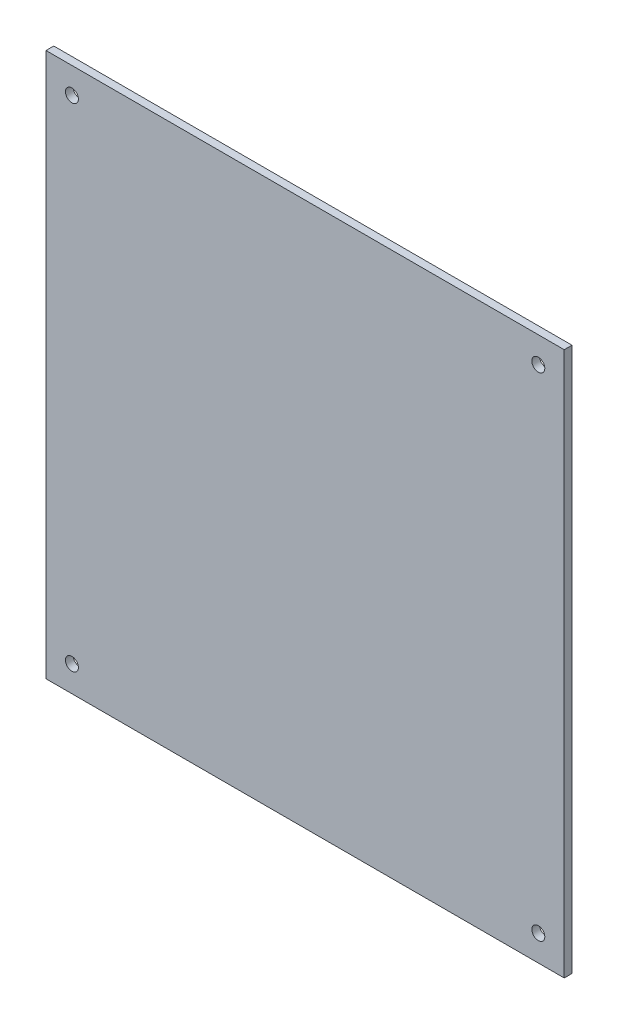
ISO-10303-21;
HEADER;
FILE_DESCRIPTION(('STEP AP214'),'2;1');
FILE_NAME('part.step','',(''),(''),'','','');
FILE_SCHEMA(('AUTOMOTIVE_DESIGN { 1 0 10303 214 1 1 1 1 }'));
ENDSEC;
DATA;
#1=APPLICATION_CONTEXT('core data for automotive mechanical design processes');
#2=APPLICATION_PROTOCOL_DEFINITION('international standard','automotive_design',2000,#1);
#3=PRODUCT_CONTEXT('',#1,'mechanical');
#4=PRODUCT('Part','Part','',(#3));
#5=PRODUCT_RELATED_PRODUCT_CATEGORY('part','',(#4));
#6=PRODUCT_DEFINITION_FORMATION('','',#4);
#7=PRODUCT_DEFINITION_CONTEXT('part definition',#1,'design');
#8=PRODUCT_DEFINITION('design','',#6,#7);
#9=PRODUCT_DEFINITION_SHAPE('','',#8);
#10=(LENGTH_UNIT() NAMED_UNIT(*) SI_UNIT(.MILLI.,.METRE.));
#11=(NAMED_UNIT(*) PLANE_ANGLE_UNIT() SI_UNIT($,.RADIAN.));
#12=(NAMED_UNIT(*) SI_UNIT($,.STERADIAN.) SOLID_ANGLE_UNIT());
#13=UNCERTAINTY_MEASURE_WITH_UNIT(LENGTH_MEASURE(1.E-05),#10,'distance_accuracy_value','');
#14=(GEOMETRIC_REPRESENTATION_CONTEXT(3) GLOBAL_UNCERTAINTY_ASSIGNED_CONTEXT((#13)) GLOBAL_UNIT_ASSIGNED_CONTEXT((#10,
#11,#12)) REPRESENTATION_CONTEXT('',''));
#15=CARTESIAN_POINT('',(0.,0.,0.));
#16=DIRECTION('',(0.,0.,1.));
#17=DIRECTION('',(1.,0.,0.));
#18=AXIS2_PLACEMENT_3D('',#15,#16,#17);
#19=CARTESIAN_POINT('',(0.,0.,13.0000000000026));
#20=DIRECTION('',(0.,0.,1.));
#21=DIRECTION('',(1.,0.,0.));
#22=AXIS2_PLACEMENT_3D('',#19,#20,#21);
#23=PLANE('',#22);
#24=CARTESIAN_POINT('',(180.,20.,13.0000000000026));
#25=DIRECTION('',(0.,0.,1.));
#26=DIRECTION('',(1.,0.,0.));
#27=AXIS2_PLACEMENT_3D('',#24,#25,#26);
#28=CIRCLE('',#27,2.5);
#29=CARTESIAN_POINT('',(182.5,20.,13.0000000000026));
#30=VERTEX_POINT('',#29);
#31=EDGE_CURVE('E129',#30,#30,#28,.T.);
#32=ORIENTED_EDGE('',*,*,#31,.F.);
#33=EDGE_LOOP('',(#32));
#34=FACE_BOUND('',#33,.T.);
#35=CARTESIAN_POINT('',(1.17638189785784E-13,210.,13.0000000000026));
#36=DIRECTION('',(0.,0.,1.));
#37=DIRECTION('',(1.,0.,0.));
#38=AXIS2_PLACEMENT_3D('',#35,#36,#37);
#39=CIRCLE('',#38,2.5);
#40=CARTESIAN_POINT('',(2.50000000000012,210.,13.0000000000026));
#41=VERTEX_POINT('',#40);
#42=EDGE_CURVE('E108',#41,#41,#39,.T.);
#43=ORIENTED_EDGE('',*,*,#42,.F.);
#44=EDGE_LOOP('',(#43));
#45=FACE_BOUND('',#44,.T.);
#46=DIRECTION('',(0.,-1.,0.));
#47=VECTOR('',#46,1.);
#48=CARTESIAN_POINT('',(-10.,220.,13.0000000000026));
#49=LINE('',#48,#47);
#50=CARTESIAN_POINT('',(-10.,220.,13.0000000000026));
#51=VERTEX_POINT('',#50);
#52=CARTESIAN_POINT('',(-10.,9.99999999999998,13.0000000000026));
#53=VERTEX_POINT('',#52);
#54=EDGE_CURVE('E93',#51,#53,#49,.T.);
#55=ORIENTED_EDGE('',*,*,#54,.T.);
#56=DIRECTION('',(1.,0.,0.));
#57=VECTOR('',#56,1.);
#58=CARTESIAN_POINT('',(-10.,9.99999999999998,13.0000000000026));
#59=LINE('',#58,#57);
#60=CARTESIAN_POINT('',(190.,9.99999999999998,13.0000000000026));
#61=VERTEX_POINT('',#60);
#62=EDGE_CURVE('E88',#53,#61,#59,.T.);
#63=ORIENTED_EDGE('',*,*,#62,.T.);
#64=DIRECTION('',(0.,1.,0.));
#65=VECTOR('',#64,1.);
#66=CARTESIAN_POINT('',(190.,220.,13.0000000000026));
#67=LINE('',#66,#65);
#68=CARTESIAN_POINT('',(190.,220.,13.0000000000026));
#69=VERTEX_POINT('',#68);
#70=EDGE_CURVE('E91',#61,#69,#67,.T.);
#71=ORIENTED_EDGE('',*,*,#70,.T.);
#72=DIRECTION('',(-1.,0.,0.));
#73=VECTOR('',#72,1.);
#74=CARTESIAN_POINT('',(-10.,220.,13.0000000000026));
#75=LINE('',#74,#73);
#76=EDGE_CURVE('E58',#69,#51,#75,.T.);
#77=ORIENTED_EDGE('',*,*,#76,.T.);
#78=EDGE_LOOP('',(#55,#63,#71,#77));
#79=FACE_BOUND('',#78,.T.);
#80=CARTESIAN_POINT('',(180.,210.,13.0000000000026));
#81=DIRECTION('',(0.,0.,1.));
#82=DIRECTION('',(-1.,0.,0.));
#83=AXIS2_PLACEMENT_3D('',#80,#81,#82);
#84=CIRCLE('',#83,2.5);
#85=CARTESIAN_POINT('',(177.5,210.,13.0000000000026));
#86=VERTEX_POINT('',#85);
#87=EDGE_CURVE('E123',#86,#86,#84,.T.);
#88=ORIENTED_EDGE('',*,*,#87,.F.);
#89=EDGE_LOOP('',(#88));
#90=FACE_BOUND('',#89,.T.);
#91=CARTESIAN_POINT('',(1.10699295881877E-13,20.,13.0000000000026));
#92=DIRECTION('',(0.,0.,1.));
#93=DIRECTION('',(-1.,0.,0.));
#94=AXIS2_PLACEMENT_3D('',#91,#92,#93);
#95=CIRCLE('',#94,2.5);
#96=CARTESIAN_POINT('',(-2.49999999999989,20.,13.0000000000026));
#97=VERTEX_POINT('',#96);
#98=EDGE_CURVE('E135',#97,#97,#95,.T.);
#99=ORIENTED_EDGE('',*,*,#98,.F.);
#100=EDGE_LOOP('',(#99));
#101=FACE_BOUND('',#100,.T.);
#102=ADVANCED_FACE('F41',(#34,#45,#79,#90,#101),#23,.T.);
#103=CARTESIAN_POINT('',(0.,0.,10.0000000000026));
#104=DIRECTION('',(0.,0.,1.));
#105=DIRECTION('',(1.,0.,0.));
#106=AXIS2_PLACEMENT_3D('',#103,#104,#105);
#107=PLANE('',#106);
#108=DIRECTION('',(0.,-1.,0.));
#109=VECTOR('',#108,1.);
#110=CARTESIAN_POINT('',(-10.,220.,10.0000000000026));
#111=LINE('',#110,#109);
#112=CARTESIAN_POINT('',(-10.,220.,10.0000000000026));
#113=VERTEX_POINT('',#112);
#114=CARTESIAN_POINT('',(-10.,9.99999999999998,10.0000000000026));
#115=VERTEX_POINT('',#114);
#116=EDGE_CURVE('E105',#113,#115,#111,.T.);
#117=ORIENTED_EDGE('',*,*,#116,.F.);
#118=DIRECTION('',(-1.,0.,0.));
#119=VECTOR('',#118,1.);
#120=CARTESIAN_POINT('',(-10.,220.,10.0000000000026));
#121=LINE('',#120,#119);
#122=CARTESIAN_POINT('',(190.,220.,10.0000000000026));
#123=VERTEX_POINT('',#122);
#124=EDGE_CURVE('E81',#123,#113,#121,.T.);
#125=ORIENTED_EDGE('',*,*,#124,.F.);
#126=DIRECTION('',(0.,1.,0.));
#127=VECTOR('',#126,1.);
#128=CARTESIAN_POINT('',(190.,220.,10.0000000000026));
#129=LINE('',#128,#127);
#130=CARTESIAN_POINT('',(190.,9.99999999999998,10.0000000000026));
#131=VERTEX_POINT('',#130);
#132=EDGE_CURVE('E75',#131,#123,#129,.T.);
#133=ORIENTED_EDGE('',*,*,#132,.F.);
#134=DIRECTION('',(1.,0.,0.));
#135=VECTOR('',#134,1.);
#136=CARTESIAN_POINT('',(-10.,9.99999999999998,10.0000000000026));
#137=LINE('',#136,#135);
#138=EDGE_CURVE('E97',#115,#131,#137,.T.);
#139=ORIENTED_EDGE('',*,*,#138,.F.);
#140=EDGE_LOOP('',(#117,#125,#133,#139));
#141=FACE_BOUND('',#140,.T.);
#142=CARTESIAN_POINT('',(1.17638189785784E-13,210.,10.0000000000026));
#143=DIRECTION('',(0.,0.,1.));
#144=DIRECTION('',(1.,0.,0.));
#145=AXIS2_PLACEMENT_3D('',#142,#143,#144);
#146=CIRCLE('',#145,2.5);
#147=CARTESIAN_POINT('',(2.50000000000012,210.,10.0000000000026));
#148=VERTEX_POINT('',#147);
#149=EDGE_CURVE('E120',#148,#148,#146,.T.);
#150=ORIENTED_EDGE('',*,*,#149,.T.);
#151=EDGE_LOOP('',(#150));
#152=FACE_BOUND('',#151,.T.);
#153=CARTESIAN_POINT('',(180.,210.,10.0000000000026));
#154=DIRECTION('',(0.,0.,1.));
#155=DIRECTION('',(-1.,0.,0.));
#156=AXIS2_PLACEMENT_3D('',#153,#154,#155);
#157=CIRCLE('',#156,2.5);
#158=CARTESIAN_POINT('',(177.5,210.,10.0000000000026));
#159=VERTEX_POINT('',#158);
#160=EDGE_CURVE('E126',#159,#159,#157,.T.);
#161=ORIENTED_EDGE('',*,*,#160,.T.);
#162=EDGE_LOOP('',(#161));
#163=FACE_BOUND('',#162,.T.);
#164=CARTESIAN_POINT('',(180.,20.,10.0000000000026));
#165=DIRECTION('',(0.,0.,1.));
#166=DIRECTION('',(1.,0.,0.));
#167=AXIS2_PLACEMENT_3D('',#164,#165,#166);
#168=CIRCLE('',#167,2.5);
#169=CARTESIAN_POINT('',(182.5,20.,10.0000000000026));
#170=VERTEX_POINT('',#169);
#171=EDGE_CURVE('E132',#170,#170,#168,.T.);
#172=ORIENTED_EDGE('',*,*,#171,.T.);
#173=EDGE_LOOP('',(#172));
#174=FACE_BOUND('',#173,.T.);
#175=CARTESIAN_POINT('',(1.10699295881877E-13,20.,10.0000000000026));
#176=DIRECTION('',(0.,0.,1.));
#177=DIRECTION('',(-1.,0.,0.));
#178=AXIS2_PLACEMENT_3D('',#175,#176,#177);
#179=CIRCLE('',#178,2.5);
#180=CARTESIAN_POINT('',(-2.49999999999989,20.,10.0000000000026));
#181=VERTEX_POINT('',#180);
#182=EDGE_CURVE('E138',#181,#181,#179,.T.);
#183=ORIENTED_EDGE('',*,*,#182,.T.);
#184=EDGE_LOOP('',(#183));
#185=FACE_BOUND('',#184,.T.);
#186=ADVANCED_FACE('F116',(#141,#152,#163,#174,#185),#107,.F.);
#187=CARTESIAN_POINT('',(-10.,220.,13.0000000000026));
#188=DIRECTION('',(1.,0.,0.));
#189=DIRECTION('',(0.,0.,-1.));
#190=AXIS2_PLACEMENT_3D('',#187,#188,#189);
#191=PLANE('',#190);
#192=ORIENTED_EDGE('',*,*,#116,.T.);
#193=DIRECTION('',(0.,0.,-1.));
#194=VECTOR('',#193,1.);
#195=CARTESIAN_POINT('',(-10.,9.99999999999998,13.0000000000026));
#196=LINE('',#195,#194);
#197=EDGE_CURVE('E11',#53,#115,#196,.T.);
#198=ORIENTED_EDGE('',*,*,#197,.F.);
#199=ORIENTED_EDGE('',*,*,#54,.F.);
#200=DIRECTION('',(0.,0.,-1.));
#201=VECTOR('',#200,1.);
#202=CARTESIAN_POINT('',(-10.,220.,13.0000000000026));
#203=LINE('',#202,#201);
#204=EDGE_CURVE('E101',#51,#113,#203,.T.);
#205=ORIENTED_EDGE('',*,*,#204,.T.);
#206=EDGE_LOOP('',(#192,#198,#199,#205));
#207=FACE_BOUND('',#206,.T.);
#208=ADVANCED_FACE('F43',(#207),#191,.F.);
#209=CARTESIAN_POINT('',(-10.,9.99999999999998,13.0000000000026));
#210=DIRECTION('',(0.,1.,0.));
#211=DIRECTION('',(0.,0.,1.));
#212=AXIS2_PLACEMENT_3D('',#209,#210,#211);
#213=PLANE('',#212);
#214=ORIENTED_EDGE('',*,*,#138,.T.);
#215=DIRECTION('',(0.,0.,-1.));
#216=VECTOR('',#215,1.);
#217=CARTESIAN_POINT('',(190.,9.99999999999998,13.0000000000026));
#218=LINE('',#217,#216);
#219=EDGE_CURVE('E50',#61,#131,#218,.T.);
#220=ORIENTED_EDGE('',*,*,#219,.F.);
#221=ORIENTED_EDGE('',*,*,#62,.F.);
#222=ORIENTED_EDGE('',*,*,#197,.T.);
#223=EDGE_LOOP('',(#214,#220,#221,#222));
#224=FACE_BOUND('',#223,.T.);
#225=ADVANCED_FACE('F96',(#224),#213,.F.);
#226=CARTESIAN_POINT('',(190.,220.,13.0000000000026));
#227=DIRECTION('',(-1.,0.,0.));
#228=DIRECTION('',(0.,0.,1.));
#229=AXIS2_PLACEMENT_3D('',#226,#227,#228);
#230=PLANE('',#229);
#231=ORIENTED_EDGE('',*,*,#132,.T.);
#232=DIRECTION('',(0.,0.,-1.));
#233=VECTOR('',#232,1.);
#234=CARTESIAN_POINT('',(190.,220.,13.0000000000026));
#235=LINE('',#234,#233);
#236=EDGE_CURVE('E98',#69,#123,#235,.T.);
#237=ORIENTED_EDGE('',*,*,#236,.F.);
#238=ORIENTED_EDGE('',*,*,#70,.F.);
#239=ORIENTED_EDGE('',*,*,#219,.T.);
#240=EDGE_LOOP('',(#231,#237,#238,#239));
#241=FACE_BOUND('',#240,.T.);
#242=ADVANCED_FACE('F99',(#241),#230,.F.);
#243=CARTESIAN_POINT('',(-10.,220.,13.0000000000026));
#244=DIRECTION('',(0.,-1.,0.));
#245=DIRECTION('',(0.,0.,-1.));
#246=AXIS2_PLACEMENT_3D('',#243,#244,#245);
#247=PLANE('',#246);
#248=ORIENTED_EDGE('',*,*,#124,.T.);
#249=ORIENTED_EDGE('',*,*,#204,.F.);
#250=ORIENTED_EDGE('',*,*,#76,.F.);
#251=ORIENTED_EDGE('',*,*,#236,.T.);
#252=EDGE_LOOP('',(#248,#249,#250,#251));
#253=FACE_BOUND('',#252,.T.);
#254=ADVANCED_FACE('F113',(#253),#247,.F.);
#255=CARTESIAN_POINT('',(1.17638189785784E-13,210.,13.0000000000026));
#256=DIRECTION('',(0.,0.,-1.));
#257=DIRECTION('',(-1.,0.,0.));
#258=AXIS2_PLACEMENT_3D('',#255,#256,#257);
#259=CYLINDRICAL_SURFACE('',#258,2.5);
#260=ORIENTED_EDGE('',*,*,#42,.T.);
#261=EDGE_LOOP('',(#260));
#262=FACE_BOUND('',#261,.T.);
#263=ORIENTED_EDGE('',*,*,#149,.F.);
#264=EDGE_LOOP('',(#263));
#265=FACE_BOUND('',#264,.T.);
#266=ADVANCED_FACE('F157',(#262,#265),#259,.F.);
#267=CARTESIAN_POINT('',(180.,210.,13.0000000000026));
#268=DIRECTION('',(0.,0.,-1.));
#269=DIRECTION('',(-1.,0.,0.));
#270=AXIS2_PLACEMENT_3D('',#267,#268,#269);
#271=CYLINDRICAL_SURFACE('',#270,2.5);
#272=ORIENTED_EDGE('',*,*,#87,.T.);
#273=EDGE_LOOP('',(#272));
#274=FACE_BOUND('',#273,.T.);
#275=ORIENTED_EDGE('',*,*,#160,.F.);
#276=EDGE_LOOP('',(#275));
#277=FACE_BOUND('',#276,.T.);
#278=ADVANCED_FACE('F220',(#274,#277),#271,.F.);
#279=CARTESIAN_POINT('',(180.,20.,13.0000000000026));
#280=DIRECTION('',(0.,0.,-1.));
#281=DIRECTION('',(-1.,0.,0.));
#282=AXIS2_PLACEMENT_3D('',#279,#280,#281);
#283=CYLINDRICAL_SURFACE('',#282,2.5);
#284=ORIENTED_EDGE('',*,*,#31,.T.);
#285=EDGE_LOOP('',(#284));
#286=FACE_BOUND('',#285,.T.);
#287=ORIENTED_EDGE('',*,*,#171,.F.);
#288=EDGE_LOOP('',(#287));
#289=FACE_BOUND('',#288,.T.);
#290=ADVANCED_FACE('F228',(#286,#289),#283,.F.);
#291=CARTESIAN_POINT('',(1.10699295881877E-13,20.,13.0000000000026));
#292=DIRECTION('',(0.,0.,-1.));
#293=DIRECTION('',(-1.,0.,0.));
#294=AXIS2_PLACEMENT_3D('',#291,#292,#293);
#295=CYLINDRICAL_SURFACE('',#294,2.5);
#296=ORIENTED_EDGE('',*,*,#98,.T.);
#297=EDGE_LOOP('',(#296));
#298=FACE_BOUND('',#297,.T.);
#299=ORIENTED_EDGE('',*,*,#182,.F.);
#300=EDGE_LOOP('',(#299));
#301=FACE_BOUND('',#300,.T.);
#302=ADVANCED_FACE('F144',(#298,#301),#295,.F.);
#303=CLOSED_SHELL('',(#102,#186,#208,#225,#242,#254,#266,#278,#290,#302));
#304=MANIFOLD_SOLID_BREP('B2',#303);
#305=ADVANCED_BREP_SHAPE_REPRESENTATION('',(#18,#304),#14);
#306=SHAPE_DEFINITION_REPRESENTATION(#9,#305);
ENDSEC;
END-ISO-10303-21;
